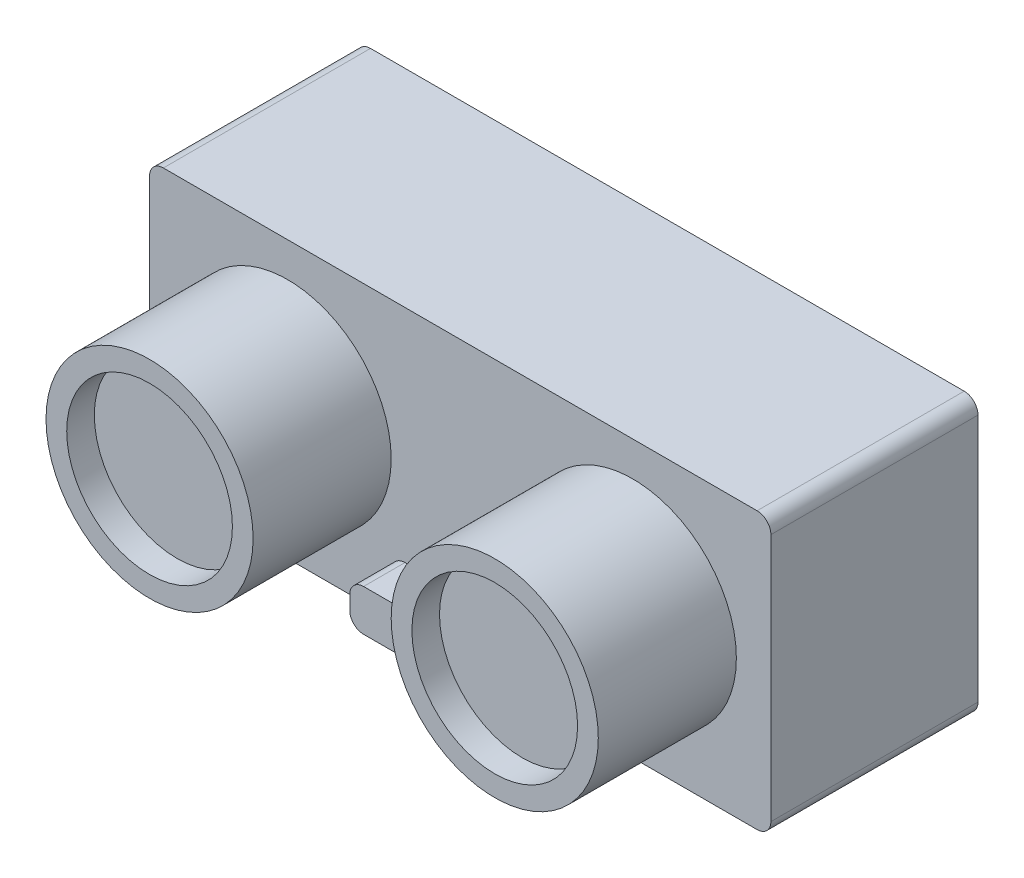
ISO-10303-21;
HEADER;
FILE_DESCRIPTION(('STEP AP214'),'2;1');
FILE_NAME('part.step','',(''),(''),'','','');
FILE_SCHEMA(('AUTOMOTIVE_DESIGN { 1 0 10303 214 1 1 1 1 }'));
ENDSEC;
DATA;
#1=APPLICATION_CONTEXT('core data for automotive mechanical design processes');
#2=APPLICATION_PROTOCOL_DEFINITION('international standard','automotive_design',2000,#1);
#3=PRODUCT_CONTEXT('',#1,'mechanical');
#4=PRODUCT('Part','Part','',(#3));
#5=PRODUCT_RELATED_PRODUCT_CATEGORY('part','',(#4));
#6=PRODUCT_DEFINITION_FORMATION('','',#4);
#7=PRODUCT_DEFINITION_CONTEXT('part definition',#1,'design');
#8=PRODUCT_DEFINITION('design','',#6,#7);
#9=PRODUCT_DEFINITION_SHAPE('','',#8);
#10=(LENGTH_UNIT() NAMED_UNIT(*) SI_UNIT(.MILLI.,.METRE.));
#11=(NAMED_UNIT(*) PLANE_ANGLE_UNIT() SI_UNIT($,.RADIAN.));
#12=(NAMED_UNIT(*) SI_UNIT($,.STERADIAN.) SOLID_ANGLE_UNIT());
#13=UNCERTAINTY_MEASURE_WITH_UNIT(LENGTH_MEASURE(1.E-05),#10,'distance_accuracy_value','');
#14=(GEOMETRIC_REPRESENTATION_CONTEXT(3) GLOBAL_UNCERTAINTY_ASSIGNED_CONTEXT((#13)) GLOBAL_UNIT_ASSIGNED_CONTEXT((#10,
#11,#12)) REPRESENTATION_CONTEXT('',''));
#15=CARTESIAN_POINT('',(0.,0.,0.));
#16=DIRECTION('',(0.,0.,1.));
#17=DIRECTION('',(1.,0.,0.));
#18=AXIS2_PLACEMENT_3D('',#15,#16,#17);
#19=CARTESIAN_POINT('',(44.,19.,15.));
#20=DIRECTION('',(0.,0.,-1.));
#21=DIRECTION('',(-1.,0.,0.));
#22=AXIS2_PLACEMENT_3D('',#19,#20,#21);
#23=PLANE('',#22);
#24=CARTESIAN_POINT('',(44.,19.,15.));
#25=DIRECTION('',(0.,0.,1.));
#26=DIRECTION('',(-1.,0.,0.));
#27=AXIS2_PLACEMENT_3D('',#24,#25,#26);
#28=CIRCLE('',#27,1.);
#29=CARTESIAN_POINT('',(45.,19.,15.));
#30=VERTEX_POINT('',#29);
#31=CARTESIAN_POINT('',(44.,20.,15.));
#32=VERTEX_POINT('',#31);
#33=EDGE_CURVE('E191',#30,#32,#28,.T.);
#34=ORIENTED_EDGE('',*,*,#33,.T.);
#35=DIRECTION('',(-1.,0.,0.));
#36=VECTOR('',#35,1.);
#37=CARTESIAN_POINT('',(1.00000000000001,20.,15.));
#38=LINE('',#37,#36);
#39=CARTESIAN_POINT('',(1.00000000000001,20.,15.));
#40=VERTEX_POINT('',#39);
#41=EDGE_CURVE('E194',#32,#40,#38,.T.);
#42=ORIENTED_EDGE('',*,*,#41,.T.);
#43=CARTESIAN_POINT('',(1.,19.,15.));
#44=DIRECTION('',(0.,0.,1.));
#45=DIRECTION('',(-1.,0.,0.));
#46=AXIS2_PLACEMENT_3D('',#43,#44,#45);
#47=CIRCLE('',#46,1.);
#48=CARTESIAN_POINT('',(0.,19.,15.));
#49=VERTEX_POINT('',#48);
#50=EDGE_CURVE('E197',#40,#49,#47,.T.);
#51=ORIENTED_EDGE('',*,*,#50,.T.);
#52=DIRECTION('',(0.,-1.,0.));
#53=VECTOR('',#52,1.);
#54=CARTESIAN_POINT('',(0.,1.00000000000001,15.));
#55=LINE('',#54,#53);
#56=CARTESIAN_POINT('',(0.,1.00000000000001,15.));
#57=VERTEX_POINT('',#56);
#58=EDGE_CURVE('E199',#49,#57,#55,.T.);
#59=ORIENTED_EDGE('',*,*,#58,.T.);
#60=CARTESIAN_POINT('',(1.,1.,15.));
#61=DIRECTION('',(0.,0.,1.));
#62=DIRECTION('',(-1.,0.,0.));
#63=AXIS2_PLACEMENT_3D('',#60,#61,#62);
#64=CIRCLE('',#63,1.);
#65=CARTESIAN_POINT('',(1.00000000000001,0.,15.));
#66=VERTEX_POINT('',#65);
#67=EDGE_CURVE('E201',#57,#66,#64,.T.);
#68=ORIENTED_EDGE('',*,*,#67,.T.);
#69=DIRECTION('',(1.,0.,0.));
#70=VECTOR('',#69,1.);
#71=CARTESIAN_POINT('',(1.00000000000001,0.,15.));
#72=LINE('',#71,#70);
#73=CARTESIAN_POINT('',(44.,0.,15.));
#74=VERTEX_POINT('',#73);
#75=EDGE_CURVE('E203',#66,#74,#72,.T.);
#76=ORIENTED_EDGE('',*,*,#75,.T.);
#77=CARTESIAN_POINT('',(44.,1.,15.));
#78=DIRECTION('',(0.,0.,1.));
#79=DIRECTION('',(1.,0.,0.));
#80=AXIS2_PLACEMENT_3D('',#77,#78,#79);
#81=CIRCLE('',#80,1.);
#82=CARTESIAN_POINT('',(45.,1.,15.));
#83=VERTEX_POINT('',#82);
#84=EDGE_CURVE('E205',#74,#83,#81,.T.);
#85=ORIENTED_EDGE('',*,*,#84,.T.);
#86=DIRECTION('',(0.,1.,0.));
#87=VECTOR('',#86,1.);
#88=CARTESIAN_POINT('',(45.,1.00000000000001,15.));
#89=LINE('',#88,#87);
#90=EDGE_CURVE('E207',#83,#30,#89,.T.);
#91=ORIENTED_EDGE('',*,*,#90,.T.);
#92=EDGE_LOOP('',(#34,#42,#51,#59,#68,#76,#85,#91));
#93=FACE_BOUND('',#92,.T.);
#94=CARTESIAN_POINT('',(9.99999999999999,10.,15.));
#95=DIRECTION('',(0.,0.,-1.));
#96=DIRECTION('',(-1.,0.,0.));
#97=AXIS2_PLACEMENT_3D('',#94,#95,#96);
#98=CIRCLE('',#97,7.5);
#99=CARTESIAN_POINT('',(2.5,10.,15.));
#100=VERTEX_POINT('',#99);
#101=EDGE_CURVE('E41',#100,#100,#98,.F.);
#102=ORIENTED_EDGE('',*,*,#101,.F.);
#103=EDGE_LOOP('',(#102));
#104=FACE_BOUND('',#103,.T.);
#105=CARTESIAN_POINT('',(35.,10.,15.));
#106=DIRECTION('',(0.,0.,-1.));
#107=DIRECTION('',(-1.,0.,0.));
#108=AXIS2_PLACEMENT_3D('',#105,#106,#107);
#109=CIRCLE('',#108,7.5);
#110=CARTESIAN_POINT('',(27.5,10.,15.));
#111=VERTEX_POINT('',#110);
#112=EDGE_CURVE('E11',#111,#111,#109,.F.);
#113=ORIENTED_EDGE('',*,*,#112,.F.);
#114=EDGE_LOOP('',(#113));
#115=FACE_BOUND('',#114,.T.);
#116=CARTESIAN_POINT('',(26.5,3.,15.));
#117=DIRECTION('',(0.,0.,1.));
#118=DIRECTION('',(-1.,0.,0.));
#119=AXIS2_PLACEMENT_3D('',#116,#117,#118);
#120=CIRCLE('',#119,1.);
#121=CARTESIAN_POINT('',(27.5,2.99999999999999,15.));
#122=VERTEX_POINT('',#121);
#123=CARTESIAN_POINT('',(26.5,4.,15.));
#124=VERTEX_POINT('',#123);
#125=EDGE_CURVE('E166',#122,#124,#120,.T.);
#126=ORIENTED_EDGE('',*,*,#125,.F.);
#127=DIRECTION('',(0.,1.,0.));
#128=VECTOR('',#127,1.);
#129=CARTESIAN_POINT('',(27.5,2.99999999999999,15.));
#130=LINE('',#129,#128);
#131=CARTESIAN_POINT('',(27.5,2.,15.));
#132=VERTEX_POINT('',#131);
#133=EDGE_CURVE('E163',#132,#122,#130,.T.);
#134=ORIENTED_EDGE('',*,*,#133,.F.);
#135=CARTESIAN_POINT('',(26.5,2.,15.));
#136=DIRECTION('',(0.,0.,1.));
#137=DIRECTION('',(1.,0.,0.));
#138=AXIS2_PLACEMENT_3D('',#135,#136,#137);
#139=CIRCLE('',#138,1.);
#140=CARTESIAN_POINT('',(26.5,1.,15.));
#141=VERTEX_POINT('',#140);
#142=EDGE_CURVE('E266',#141,#132,#139,.T.);
#143=ORIENTED_EDGE('',*,*,#142,.F.);
#144=DIRECTION('',(1.,0.,0.));
#145=VECTOR('',#144,1.);
#146=CARTESIAN_POINT('',(18.5,1.,15.));
#147=LINE('',#146,#145);
#148=CARTESIAN_POINT('',(18.5,1.,15.));
#149=VERTEX_POINT('',#148);
#150=EDGE_CURVE('E300',#149,#141,#147,.T.);
#151=ORIENTED_EDGE('',*,*,#150,.F.);
#152=CARTESIAN_POINT('',(18.5,2.,15.));
#153=DIRECTION('',(0.,0.,1.));
#154=DIRECTION('',(1.,0.,0.));
#155=AXIS2_PLACEMENT_3D('',#152,#153,#154);
#156=CIRCLE('',#155,1.);
#157=CARTESIAN_POINT('',(17.5,2.,15.));
#158=VERTEX_POINT('',#157);
#159=EDGE_CURVE('E294',#158,#149,#156,.T.);
#160=ORIENTED_EDGE('',*,*,#159,.F.);
#161=DIRECTION('',(0.,-1.,0.));
#162=VECTOR('',#161,1.);
#163=CARTESIAN_POINT('',(17.5,2.99999999999999,15.));
#164=LINE('',#163,#162);
#165=CARTESIAN_POINT('',(17.5,2.99999999999999,15.));
#166=VERTEX_POINT('',#165);
#167=EDGE_CURVE('E289',#166,#158,#164,.T.);
#168=ORIENTED_EDGE('',*,*,#167,.F.);
#169=CARTESIAN_POINT('',(18.5,3.,15.));
#170=DIRECTION('',(0.,0.,1.));
#171=DIRECTION('',(1.,0.,0.));
#172=AXIS2_PLACEMENT_3D('',#169,#170,#171);
#173=CIRCLE('',#172,1.);
#174=CARTESIAN_POINT('',(18.5,4.,15.));
#175=VERTEX_POINT('',#174);
#176=EDGE_CURVE('E53',#175,#166,#173,.T.);
#177=ORIENTED_EDGE('',*,*,#176,.F.);
#178=DIRECTION('',(-1.,0.,0.));
#179=VECTOR('',#178,1.);
#180=CARTESIAN_POINT('',(18.5,4.,15.));
#181=LINE('',#180,#179);
#182=EDGE_CURVE('E48',#124,#175,#181,.T.);
#183=ORIENTED_EDGE('',*,*,#182,.F.);
#184=EDGE_LOOP('',(#126,#134,#143,#151,#160,#168,#177,#183));
#185=FACE_BOUND('',#184,.T.);
#186=ADVANCED_FACE('F33',(#93,#104,#115,#185),#23,.F.);
#187=CARTESIAN_POINT('',(44.,19.,15.));
#188=DIRECTION('',(0.,0.,-1.));
#189=DIRECTION('',(-1.,0.,0.));
#190=AXIS2_PLACEMENT_3D('',#187,#188,#189);
#191=CYLINDRICAL_SURFACE('',#190,1.);
#192=CARTESIAN_POINT('',(44.,19.,0.));
#193=DIRECTION('',(0.,0.,1.));
#194=DIRECTION('',(-1.,0.,0.));
#195=AXIS2_PLACEMENT_3D('',#192,#193,#194);
#196=CIRCLE('',#195,1.);
#197=CARTESIAN_POINT('',(45.,19.,0.));
#198=VERTEX_POINT('',#197);
#199=CARTESIAN_POINT('',(44.,20.,0.));
#200=VERTEX_POINT('',#199);
#201=EDGE_CURVE('E190',#198,#200,#196,.T.);
#202=ORIENTED_EDGE('',*,*,#201,.T.);
#203=DIRECTION('',(0.,0.,-1.));
#204=VECTOR('',#203,1.);
#205=CARTESIAN_POINT('',(44.,20.,15.));
#206=LINE('',#205,#204);
#207=EDGE_CURVE('E245',#32,#200,#206,.T.);
#208=ORIENTED_EDGE('',*,*,#207,.F.);
#209=ORIENTED_EDGE('',*,*,#33,.F.);
#210=DIRECTION('',(0.,0.,-1.));
#211=VECTOR('',#210,1.);
#212=CARTESIAN_POINT('',(45.,19.,15.));
#213=LINE('',#212,#211);
#214=EDGE_CURVE('E209',#30,#198,#213,.T.);
#215=ORIENTED_EDGE('',*,*,#214,.T.);
#216=EDGE_LOOP('',(#202,#208,#209,#215));
#217=FACE_BOUND('',#216,.T.);
#218=ADVANCED_FACE('F35',(#217),#191,.T.);
#219=CARTESIAN_POINT('',(1.00000000000001,20.,15.));
#220=DIRECTION('',(0.,-1.,0.));
#221=DIRECTION('',(0.,0.,-1.));
#222=AXIS2_PLACEMENT_3D('',#219,#220,#221);
#223=PLANE('',#222);
#224=DIRECTION('',(-1.,0.,0.));
#225=VECTOR('',#224,1.);
#226=CARTESIAN_POINT('',(1.00000000000001,20.,0.));
#227=LINE('',#226,#225);
#228=CARTESIAN_POINT('',(1.00000000000001,20.,0.));
#229=VERTEX_POINT('',#228);
#230=EDGE_CURVE('E212',#200,#229,#227,.T.);
#231=ORIENTED_EDGE('',*,*,#230,.T.);
#232=DIRECTION('',(0.,0.,-1.));
#233=VECTOR('',#232,1.);
#234=CARTESIAN_POINT('',(1.00000000000001,20.,15.));
#235=LINE('',#234,#233);
#236=EDGE_CURVE('E242',#40,#229,#235,.T.);
#237=ORIENTED_EDGE('',*,*,#236,.F.);
#238=ORIENTED_EDGE('',*,*,#41,.F.);
#239=ORIENTED_EDGE('',*,*,#207,.T.);
#240=EDGE_LOOP('',(#231,#237,#238,#239));
#241=FACE_BOUND('',#240,.T.);
#242=ADVANCED_FACE('F393',(#241),#223,.F.);
#243=CARTESIAN_POINT('',(1.,19.,15.));
#244=DIRECTION('',(0.,0.,-1.));
#245=DIRECTION('',(-1.,0.,0.));
#246=AXIS2_PLACEMENT_3D('',#243,#244,#245);
#247=CYLINDRICAL_SURFACE('',#246,1.);
#248=CARTESIAN_POINT('',(1.,19.,0.));
#249=DIRECTION('',(0.,0.,1.));
#250=DIRECTION('',(-1.,0.,0.));
#251=AXIS2_PLACEMENT_3D('',#248,#249,#250);
#252=CIRCLE('',#251,1.);
#253=CARTESIAN_POINT('',(0.,19.,0.));
#254=VERTEX_POINT('',#253);
#255=EDGE_CURVE('E214',#229,#254,#252,.T.);
#256=ORIENTED_EDGE('',*,*,#255,.T.);
#257=DIRECTION('',(0.,0.,-1.));
#258=VECTOR('',#257,1.);
#259=CARTESIAN_POINT('',(0.,19.,15.));
#260=LINE('',#259,#258);
#261=EDGE_CURVE('E239',#49,#254,#260,.T.);
#262=ORIENTED_EDGE('',*,*,#261,.F.);
#263=ORIENTED_EDGE('',*,*,#50,.F.);
#264=ORIENTED_EDGE('',*,*,#236,.T.);
#265=EDGE_LOOP('',(#256,#262,#263,#264));
#266=FACE_BOUND('',#265,.T.);
#267=ADVANCED_FACE('F390',(#266),#247,.T.);
#268=CARTESIAN_POINT('',(0.,1.00000000000001,15.));
#269=DIRECTION('',(1.,0.,0.));
#270=DIRECTION('',(0.,0.,-1.));
#271=AXIS2_PLACEMENT_3D('',#268,#269,#270);
#272=PLANE('',#271);
#273=DIRECTION('',(0.,-1.,0.));
#274=VECTOR('',#273,1.);
#275=CARTESIAN_POINT('',(0.,1.00000000000001,0.));
#276=LINE('',#275,#274);
#277=CARTESIAN_POINT('',(0.,1.00000000000001,0.));
#278=VERTEX_POINT('',#277);
#279=EDGE_CURVE('E216',#254,#278,#276,.T.);
#280=ORIENTED_EDGE('',*,*,#279,.T.);
#281=DIRECTION('',(0.,0.,-1.));
#282=VECTOR('',#281,1.);
#283=CARTESIAN_POINT('',(0.,1.00000000000001,15.));
#284=LINE('',#283,#282);
#285=EDGE_CURVE('E236',#57,#278,#284,.T.);
#286=ORIENTED_EDGE('',*,*,#285,.F.);
#287=ORIENTED_EDGE('',*,*,#58,.F.);
#288=ORIENTED_EDGE('',*,*,#261,.T.);
#289=EDGE_LOOP('',(#280,#286,#287,#288));
#290=FACE_BOUND('',#289,.T.);
#291=ADVANCED_FACE('F386',(#290),#272,.F.);
#292=CARTESIAN_POINT('',(1.,1.,15.));
#293=DIRECTION('',(0.,0.,-1.));
#294=DIRECTION('',(-1.,0.,0.));
#295=AXIS2_PLACEMENT_3D('',#292,#293,#294);
#296=CYLINDRICAL_SURFACE('',#295,1.);
#297=CARTESIAN_POINT('',(1.,1.,0.));
#298=DIRECTION('',(0.,0.,1.));
#299=DIRECTION('',(-1.,0.,0.));
#300=AXIS2_PLACEMENT_3D('',#297,#298,#299);
#301=CIRCLE('',#300,1.);
#302=CARTESIAN_POINT('',(1.00000000000001,0.,0.));
#303=VERTEX_POINT('',#302);
#304=EDGE_CURVE('E218',#278,#303,#301,.T.);
#305=ORIENTED_EDGE('',*,*,#304,.T.);
#306=DIRECTION('',(0.,0.,-1.));
#307=VECTOR('',#306,1.);
#308=CARTESIAN_POINT('',(1.00000000000001,0.,15.));
#309=LINE('',#308,#307);
#310=EDGE_CURVE('E233',#66,#303,#309,.T.);
#311=ORIENTED_EDGE('',*,*,#310,.F.);
#312=ORIENTED_EDGE('',*,*,#67,.F.);
#313=ORIENTED_EDGE('',*,*,#285,.T.);
#314=EDGE_LOOP('',(#305,#311,#312,#313));
#315=FACE_BOUND('',#314,.T.);
#316=ADVANCED_FACE('F382',(#315),#296,.T.);
#317=CARTESIAN_POINT('',(1.00000000000001,0.,15.));
#318=DIRECTION('',(0.,1.,0.));
#319=DIRECTION('',(0.,0.,1.));
#320=AXIS2_PLACEMENT_3D('',#317,#318,#319);
#321=PLANE('',#320);
#322=DIRECTION('',(1.,0.,0.));
#323=VECTOR('',#322,1.);
#324=CARTESIAN_POINT('',(1.00000000000001,0.,0.));
#325=LINE('',#324,#323);
#326=CARTESIAN_POINT('',(44.,0.,0.));
#327=VERTEX_POINT('',#326);
#328=EDGE_CURVE('E220',#303,#327,#325,.T.);
#329=ORIENTED_EDGE('',*,*,#328,.T.);
#330=DIRECTION('',(0.,0.,-1.));
#331=VECTOR('',#330,1.);
#332=CARTESIAN_POINT('',(44.,0.,15.));
#333=LINE('',#332,#331);
#334=EDGE_CURVE('E230',#74,#327,#333,.T.);
#335=ORIENTED_EDGE('',*,*,#334,.F.);
#336=ORIENTED_EDGE('',*,*,#75,.F.);
#337=ORIENTED_EDGE('',*,*,#310,.T.);
#338=EDGE_LOOP('',(#329,#335,#336,#337));
#339=FACE_BOUND('',#338,.T.);
#340=ADVANCED_FACE('F378',(#339),#321,.F.);
#341=CARTESIAN_POINT('',(44.,1.,15.));
#342=DIRECTION('',(0.,0.,-1.));
#343=DIRECTION('',(-1.,0.,0.));
#344=AXIS2_PLACEMENT_3D('',#341,#342,#343);
#345=CYLINDRICAL_SURFACE('',#344,1.);
#346=CARTESIAN_POINT('',(44.,1.,0.));
#347=DIRECTION('',(0.,0.,1.));
#348=DIRECTION('',(1.,0.,0.));
#349=AXIS2_PLACEMENT_3D('',#346,#347,#348);
#350=CIRCLE('',#349,1.);
#351=CARTESIAN_POINT('',(45.,1.,0.));
#352=VERTEX_POINT('',#351);
#353=EDGE_CURVE('E222',#327,#352,#350,.T.);
#354=ORIENTED_EDGE('',*,*,#353,.T.);
#355=DIRECTION('',(0.,0.,-1.));
#356=VECTOR('',#355,1.);
#357=CARTESIAN_POINT('',(45.,1.,15.));
#358=LINE('',#357,#356);
#359=EDGE_CURVE('E227',#83,#352,#358,.T.);
#360=ORIENTED_EDGE('',*,*,#359,.F.);
#361=ORIENTED_EDGE('',*,*,#84,.F.);
#362=ORIENTED_EDGE('',*,*,#334,.T.);
#363=EDGE_LOOP('',(#354,#360,#361,#362));
#364=FACE_BOUND('',#363,.T.);
#365=ADVANCED_FACE('F374',(#364),#345,.T.);
#366=CARTESIAN_POINT('',(45.,1.00000000000001,15.));
#367=DIRECTION('',(-1.,0.,0.));
#368=DIRECTION('',(0.,0.,1.));
#369=AXIS2_PLACEMENT_3D('',#366,#367,#368);
#370=PLANE('',#369);
#371=DIRECTION('',(0.,1.,0.));
#372=VECTOR('',#371,1.);
#373=CARTESIAN_POINT('',(45.,1.00000000000001,0.));
#374=LINE('',#373,#372);
#375=EDGE_CURVE('E195',#352,#198,#374,.T.);
#376=ORIENTED_EDGE('',*,*,#375,.T.);
#377=ORIENTED_EDGE('',*,*,#214,.F.);
#378=ORIENTED_EDGE('',*,*,#90,.F.);
#379=ORIENTED_EDGE('',*,*,#359,.T.);
#380=EDGE_LOOP('',(#376,#377,#378,#379));
#381=FACE_BOUND('',#380,.T.);
#382=ADVANCED_FACE('F370',(#381),#370,.F.);
#383=CARTESIAN_POINT('',(44.,19.,0.));
#384=DIRECTION('',(0.,0.,-1.));
#385=DIRECTION('',(-1.,0.,0.));
#386=AXIS2_PLACEMENT_3D('',#383,#384,#385);
#387=PLANE('',#386);
#388=ORIENTED_EDGE('',*,*,#201,.F.);
#389=ORIENTED_EDGE('',*,*,#375,.F.);
#390=ORIENTED_EDGE('',*,*,#353,.F.);
#391=ORIENTED_EDGE('',*,*,#328,.F.);
#392=ORIENTED_EDGE('',*,*,#304,.F.);
#393=ORIENTED_EDGE('',*,*,#279,.F.);
#394=ORIENTED_EDGE('',*,*,#255,.F.);
#395=ORIENTED_EDGE('',*,*,#230,.F.);
#396=EDGE_LOOP('',(#388,#389,#390,#391,#392,#393,#394,#395));
#397=FACE_BOUND('',#396,.T.);
#398=ADVANCED_FACE('F365',(#397),#387,.T.);
#399=CARTESIAN_POINT('',(9.99999999999999,10.,25.));
#400=DIRECTION('',(0.,0.,-1.));
#401=DIRECTION('',(-1.,0.,0.));
#402=AXIS2_PLACEMENT_3D('',#399,#400,#401);
#403=CYLINDRICAL_SURFACE('',#402,7.5);
#404=CARTESIAN_POINT('',(9.99999999999999,10.,25.));
#405=DIRECTION('',(0.,0.,1.));
#406=DIRECTION('',(1.,0.,0.));
#407=AXIS2_PLACEMENT_3D('',#404,#405,#406);
#408=CIRCLE('',#407,7.5);
#409=CARTESIAN_POINT('',(17.5,10.,25.));
#410=VERTEX_POINT('',#409);
#411=EDGE_CURVE('E187',#410,#410,#408,.T.);
#412=ORIENTED_EDGE('',*,*,#411,.F.);
#413=EDGE_LOOP('',(#412));
#414=FACE_BOUND('',#413,.T.);
#415=ORIENTED_EDGE('',*,*,#101,.T.);
#416=EDGE_LOOP('',(#415));
#417=FACE_BOUND('',#416,.T.);
#418=ADVANCED_FACE('F250',(#414,#417),#403,.T.);
#419=CARTESIAN_POINT('',(9.99999999999999,10.,25.));
#420=DIRECTION('',(0.,0.,1.));
#421=DIRECTION('',(1.,0.,0.));
#422=AXIS2_PLACEMENT_3D('',#419,#420,#421);
#423=PLANE('',#422);
#424=CARTESIAN_POINT('',(9.99999999999999,10.,25.));
#425=DIRECTION('',(0.,0.,1.));
#426=DIRECTION('',(1.,0.,0.));
#427=AXIS2_PLACEMENT_3D('',#424,#425,#426);
#428=CIRCLE('',#427,6.);
#429=CARTESIAN_POINT('',(16.,10.,25.));
#430=VERTEX_POINT('',#429);
#431=EDGE_CURVE('E177',#430,#430,#428,.T.);
#432=ORIENTED_EDGE('',*,*,#431,.F.);
#433=EDGE_LOOP('',(#432));
#434=FACE_BOUND('',#433,.T.);
#435=ORIENTED_EDGE('',*,*,#411,.T.);
#436=EDGE_LOOP('',(#435));
#437=FACE_BOUND('',#436,.T.);
#438=ADVANCED_FACE('F359',(#434,#437),#423,.T.);
#439=CARTESIAN_POINT('',(35.,10.,25.));
#440=DIRECTION('',(0.,0.,-1.));
#441=DIRECTION('',(-1.,0.,0.));
#442=AXIS2_PLACEMENT_3D('',#439,#440,#441);
#443=CYLINDRICAL_SURFACE('',#442,7.5);
#444=CARTESIAN_POINT('',(35.,10.,25.));
#445=DIRECTION('',(0.,0.,1.));
#446=DIRECTION('',(1.,0.,0.));
#447=AXIS2_PLACEMENT_3D('',#444,#445,#446);
#448=CIRCLE('',#447,7.5);
#449=CARTESIAN_POINT('',(42.5,10.,25.));
#450=VERTEX_POINT('',#449);
#451=EDGE_CURVE('E182',#450,#450,#448,.T.);
#452=ORIENTED_EDGE('',*,*,#451,.F.);
#453=EDGE_LOOP('',(#452));
#454=FACE_BOUND('',#453,.T.);
#455=ORIENTED_EDGE('',*,*,#112,.T.);
#456=EDGE_LOOP('',(#455));
#457=FACE_BOUND('',#456,.T.);
#458=ADVANCED_FACE('F355',(#454,#457),#443,.T.);
#459=CARTESIAN_POINT('',(35.,10.,25.));
#460=DIRECTION('',(0.,0.,1.));
#461=DIRECTION('',(1.,0.,0.));
#462=AXIS2_PLACEMENT_3D('',#459,#460,#461);
#463=PLANE('',#462);
#464=CARTESIAN_POINT('',(35.,10.,25.));
#465=DIRECTION('',(0.,0.,1.));
#466=DIRECTION('',(1.,0.,0.));
#467=AXIS2_PLACEMENT_3D('',#464,#465,#466);
#468=CIRCLE('',#467,5.99999999999999);
#469=CARTESIAN_POINT('',(41.,10.,25.));
#470=VERTEX_POINT('',#469);
#471=EDGE_CURVE('E167',#470,#470,#468,.T.);
#472=ORIENTED_EDGE('',*,*,#471,.F.);
#473=EDGE_LOOP('',(#472));
#474=FACE_BOUND('',#473,.T.);
#475=ORIENTED_EDGE('',*,*,#451,.T.);
#476=EDGE_LOOP('',(#475));
#477=FACE_BOUND('',#476,.T.);
#478=ADVANCED_FACE('F351',(#474,#477),#463,.T.);
#479=CARTESIAN_POINT('',(9.99999999999999,10.,23.));
#480=DIRECTION('',(0.,0.,1.));
#481=DIRECTION('',(1.,0.,0.));
#482=AXIS2_PLACEMENT_3D('',#479,#480,#481);
#483=CYLINDRICAL_SURFACE('',#482,6.);
#484=CARTESIAN_POINT('',(9.99999999999999,10.,23.));
#485=DIRECTION('',(0.,0.,1.));
#486=DIRECTION('',(1.,0.,0.));
#487=AXIS2_PLACEMENT_3D('',#484,#485,#486);
#488=CIRCLE('',#487,6.);
#489=CARTESIAN_POINT('',(16.,10.,23.));
#490=VERTEX_POINT('',#489);
#491=EDGE_CURVE('E179',#490,#490,#488,.T.);
#492=ORIENTED_EDGE('',*,*,#491,.F.);
#493=EDGE_LOOP('',(#492));
#494=FACE_BOUND('',#493,.T.);
#495=ORIENTED_EDGE('',*,*,#431,.T.);
#496=EDGE_LOOP('',(#495));
#497=FACE_BOUND('',#496,.T.);
#498=ADVANCED_FACE('F347',(#494,#497),#483,.F.);
#499=CARTESIAN_POINT('',(9.99999999999999,10.,23.));
#500=DIRECTION('',(0.,0.,1.));
#501=DIRECTION('',(1.,0.,0.));
#502=AXIS2_PLACEMENT_3D('',#499,#500,#501);
#503=PLANE('',#502);
#504=ORIENTED_EDGE('',*,*,#491,.T.);
#505=EDGE_LOOP('',(#504));
#506=FACE_BOUND('',#505,.T.);
#507=ADVANCED_FACE('F343',(#506),#503,.T.);
#508=CARTESIAN_POINT('',(35.,10.,23.));
#509=DIRECTION('',(0.,0.,1.));
#510=DIRECTION('',(1.,0.,0.));
#511=AXIS2_PLACEMENT_3D('',#508,#509,#510);
#512=CYLINDRICAL_SURFACE('',#511,5.99999999999999);
#513=CARTESIAN_POINT('',(35.,10.,23.));
#514=DIRECTION('',(0.,0.,1.));
#515=DIRECTION('',(1.,0.,0.));
#516=AXIS2_PLACEMENT_3D('',#513,#514,#515);
#517=CIRCLE('',#516,5.99999999999999);
#518=CARTESIAN_POINT('',(41.,10.,23.));
#519=VERTEX_POINT('',#518);
#520=EDGE_CURVE('E170',#519,#519,#517,.T.);
#521=ORIENTED_EDGE('',*,*,#520,.F.);
#522=EDGE_LOOP('',(#521));
#523=FACE_BOUND('',#522,.T.);
#524=ORIENTED_EDGE('',*,*,#471,.T.);
#525=EDGE_LOOP('',(#524));
#526=FACE_BOUND('',#525,.T.);
#527=ADVANCED_FACE('F339',(#523,#526),#512,.F.);
#528=CARTESIAN_POINT('',(35.,10.,23.));
#529=DIRECTION('',(0.,0.,1.));
#530=DIRECTION('',(1.,0.,0.));
#531=AXIS2_PLACEMENT_3D('',#528,#529,#530);
#532=PLANE('',#531);
#533=ORIENTED_EDGE('',*,*,#520,.T.);
#534=EDGE_LOOP('',(#533));
#535=FACE_BOUND('',#534,.T.);
#536=ADVANCED_FACE('F336',(#535),#532,.T.);
#537=CARTESIAN_POINT('',(26.5,3.,18.));
#538=DIRECTION('',(0.,0.,-1.));
#539=DIRECTION('',(-1.,0.,0.));
#540=AXIS2_PLACEMENT_3D('',#537,#538,#539);
#541=CYLINDRICAL_SURFACE('',#540,1.);
#542=ORIENTED_EDGE('',*,*,#125,.T.);
#543=DIRECTION('',(0.,0.,-1.));
#544=VECTOR('',#543,1.);
#545=CARTESIAN_POINT('',(26.5,4.,18.));
#546=LINE('',#545,#544);
#547=CARTESIAN_POINT('',(26.5,4.,18.));
#548=VERTEX_POINT('',#547);
#549=EDGE_CURVE('E147',#548,#124,#546,.T.);
#550=ORIENTED_EDGE('',*,*,#549,.F.);
#551=CARTESIAN_POINT('',(26.5,3.,18.));
#552=DIRECTION('',(0.,0.,1.));
#553=DIRECTION('',(-1.,0.,0.));
#554=AXIS2_PLACEMENT_3D('',#551,#552,#553);
#555=CIRCLE('',#554,1.);
#556=CARTESIAN_POINT('',(27.5,2.99999999999999,18.));
#557=VERTEX_POINT('',#556);
#558=EDGE_CURVE('E154',#557,#548,#555,.T.);
#559=ORIENTED_EDGE('',*,*,#558,.F.);
#560=DIRECTION('',(0.,0.,-1.));
#561=VECTOR('',#560,1.);
#562=CARTESIAN_POINT('',(27.5,2.99999999999999,18.));
#563=LINE('',#562,#561);
#564=EDGE_CURVE('E263',#557,#122,#563,.T.);
#565=ORIENTED_EDGE('',*,*,#564,.T.);
#566=EDGE_LOOP('',(#542,#550,#559,#565));
#567=FACE_BOUND('',#566,.T.);
#568=ADVANCED_FACE('F165',(#567),#541,.T.);
#569=CARTESIAN_POINT('',(18.5,4.,18.));
#570=DIRECTION('',(0.,-1.,0.));
#571=DIRECTION('',(1.,0.,0.));
#572=AXIS2_PLACEMENT_3D('',#569,#570,#571);
#573=PLANE('',#572);
#574=ORIENTED_EDGE('',*,*,#182,.T.);
#575=DIRECTION('',(0.,0.,-1.));
#576=VECTOR('',#575,1.);
#577=CARTESIAN_POINT('',(18.5,4.,18.));
#578=LINE('',#577,#576);
#579=CARTESIAN_POINT('',(18.5,4.,18.));
#580=VERTEX_POINT('',#579);
#581=EDGE_CURVE('E150',#580,#175,#578,.T.);
#582=ORIENTED_EDGE('',*,*,#581,.F.);
#583=DIRECTION('',(-1.,0.,0.));
#584=VECTOR('',#583,1.);
#585=CARTESIAN_POINT('',(18.5,4.,18.));
#586=LINE('',#585,#584);
#587=EDGE_CURVE('E143',#548,#580,#586,.T.);
#588=ORIENTED_EDGE('',*,*,#587,.F.);
#589=ORIENTED_EDGE('',*,*,#549,.T.);
#590=EDGE_LOOP('',(#574,#582,#588,#589));
#591=FACE_BOUND('',#590,.T.);
#592=ADVANCED_FACE('F145',(#591),#573,.F.);
#593=CARTESIAN_POINT('',(18.5,3.,18.));
#594=DIRECTION('',(0.,0.,-1.));
#595=DIRECTION('',(-1.,0.,0.));
#596=AXIS2_PLACEMENT_3D('',#593,#594,#595);
#597=CYLINDRICAL_SURFACE('',#596,1.);
#598=ORIENTED_EDGE('',*,*,#176,.T.);
#599=DIRECTION('',(0.,0.,-1.));
#600=VECTOR('',#599,1.);
#601=CARTESIAN_POINT('',(17.5,2.99999999999999,18.));
#602=LINE('',#601,#600);
#603=CARTESIAN_POINT('',(17.5,2.99999999999999,18.));
#604=VERTEX_POINT('',#603);
#605=EDGE_CURVE('E172',#604,#166,#602,.T.);
#606=ORIENTED_EDGE('',*,*,#605,.F.);
#607=CARTESIAN_POINT('',(18.5,3.,18.));
#608=DIRECTION('',(0.,0.,1.));
#609=DIRECTION('',(1.,0.,0.));
#610=AXIS2_PLACEMENT_3D('',#607,#608,#609);
#611=CIRCLE('',#610,1.);
#612=EDGE_CURVE('E153',#580,#604,#611,.T.);
#613=ORIENTED_EDGE('',*,*,#612,.F.);
#614=ORIENTED_EDGE('',*,*,#581,.T.);
#615=EDGE_LOOP('',(#598,#606,#613,#614));
#616=FACE_BOUND('',#615,.T.);
#617=ADVANCED_FACE('F292',(#616),#597,.T.);
#618=CARTESIAN_POINT('',(17.5,2.99999999999999,18.));
#619=DIRECTION('',(1.,0.,0.));
#620=DIRECTION('',(0.,0.,-1.));
#621=AXIS2_PLACEMENT_3D('',#618,#619,#620);
#622=PLANE('',#621);
#623=ORIENTED_EDGE('',*,*,#167,.T.);
#624=DIRECTION('',(0.,0.,-1.));
#625=VECTOR('',#624,1.);
#626=CARTESIAN_POINT('',(17.5,2.00000000000001,18.));
#627=LINE('',#626,#625);
#628=CARTESIAN_POINT('',(17.5,2.00000000000001,18.));
#629=VERTEX_POINT('',#628);
#630=EDGE_CURVE('E280',#629,#158,#627,.T.);
#631=ORIENTED_EDGE('',*,*,#630,.F.);
#632=DIRECTION('',(0.,-1.,0.));
#633=VECTOR('',#632,1.);
#634=CARTESIAN_POINT('',(17.5,2.99999999999999,18.));
#635=LINE('',#634,#633);
#636=EDGE_CURVE('E290',#604,#629,#635,.T.);
#637=ORIENTED_EDGE('',*,*,#636,.F.);
#638=ORIENTED_EDGE('',*,*,#605,.T.);
#639=EDGE_LOOP('',(#623,#631,#637,#638));
#640=FACE_BOUND('',#639,.T.);
#641=ADVANCED_FACE('F287',(#640),#622,.F.);
#642=CARTESIAN_POINT('',(18.5,2.,18.));
#643=DIRECTION('',(0.,0.,-1.));
#644=DIRECTION('',(-1.,0.,0.));
#645=AXIS2_PLACEMENT_3D('',#642,#643,#644);
#646=CYLINDRICAL_SURFACE('',#645,1.);
#647=ORIENTED_EDGE('',*,*,#159,.T.);
#648=DIRECTION('',(0.,0.,-1.));
#649=VECTOR('',#648,1.);
#650=CARTESIAN_POINT('',(18.5,1.,18.));
#651=LINE('',#650,#649);
#652=CARTESIAN_POINT('',(18.5,1.,18.));
#653=VERTEX_POINT('',#652);
#654=EDGE_CURVE('E277',#653,#149,#651,.T.);
#655=ORIENTED_EDGE('',*,*,#654,.F.);
#656=CARTESIAN_POINT('',(18.5,2.,18.));
#657=DIRECTION('',(0.,0.,1.));
#658=DIRECTION('',(1.,0.,0.));
#659=AXIS2_PLACEMENT_3D('',#656,#657,#658);
#660=CIRCLE('',#659,1.);
#661=EDGE_CURVE('E314',#629,#653,#660,.T.);
#662=ORIENTED_EDGE('',*,*,#661,.F.);
#663=ORIENTED_EDGE('',*,*,#630,.T.);
#664=EDGE_LOOP('',(#647,#655,#662,#663));
#665=FACE_BOUND('',#664,.T.);
#666=ADVANCED_FACE('F313',(#665),#646,.T.);
#667=CARTESIAN_POINT('',(18.5,1.,18.));
#668=DIRECTION('',(0.,1.,0.));
#669=DIRECTION('',(0.,0.,1.));
#670=AXIS2_PLACEMENT_3D('',#667,#668,#669);
#671=PLANE('',#670);
#672=ORIENTED_EDGE('',*,*,#150,.T.);
#673=DIRECTION('',(0.,0.,-1.));
#674=VECTOR('',#673,1.);
#675=CARTESIAN_POINT('',(26.5,1.,18.));
#676=LINE('',#675,#674);
#677=CARTESIAN_POINT('',(26.5,1.,18.));
#678=VERTEX_POINT('',#677);
#679=EDGE_CURVE('E269',#678,#141,#676,.T.);
#680=ORIENTED_EDGE('',*,*,#679,.F.);
#681=DIRECTION('',(1.,0.,0.));
#682=VECTOR('',#681,1.);
#683=CARTESIAN_POINT('',(18.5,1.,18.));
#684=LINE('',#683,#682);
#685=EDGE_CURVE('E310',#653,#678,#684,.T.);
#686=ORIENTED_EDGE('',*,*,#685,.F.);
#687=ORIENTED_EDGE('',*,*,#654,.T.);
#688=EDGE_LOOP('',(#672,#680,#686,#687));
#689=FACE_BOUND('',#688,.T.);
#690=ADVANCED_FACE('F307',(#689),#671,.F.);
#691=CARTESIAN_POINT('',(26.5,2.,18.));
#692=DIRECTION('',(0.,0.,-1.));
#693=DIRECTION('',(-1.,0.,0.));
#694=AXIS2_PLACEMENT_3D('',#691,#692,#693);
#695=CYLINDRICAL_SURFACE('',#694,1.);
#696=ORIENTED_EDGE('',*,*,#142,.T.);
#697=DIRECTION('',(0.,0.,-1.));
#698=VECTOR('',#697,1.);
#699=CARTESIAN_POINT('',(27.5,2.,18.));
#700=LINE('',#699,#698);
#701=CARTESIAN_POINT('',(27.5,2.,18.));
#702=VERTEX_POINT('',#701);
#703=EDGE_CURVE('E265',#702,#132,#700,.T.);
#704=ORIENTED_EDGE('',*,*,#703,.F.);
#705=CARTESIAN_POINT('',(26.5,2.,18.));
#706=DIRECTION('',(0.,0.,1.));
#707=DIRECTION('',(1.,0.,0.));
#708=AXIS2_PLACEMENT_3D('',#705,#706,#707);
#709=CIRCLE('',#708,1.);
#710=EDGE_CURVE('E271',#678,#702,#709,.T.);
#711=ORIENTED_EDGE('',*,*,#710,.F.);
#712=ORIENTED_EDGE('',*,*,#679,.T.);
#713=EDGE_LOOP('',(#696,#704,#711,#712));
#714=FACE_BOUND('',#713,.T.);
#715=ADVANCED_FACE('F303',(#714),#695,.T.);
#716=CARTESIAN_POINT('',(27.5,2.99999999999999,18.));
#717=DIRECTION('',(-1.,0.,0.));
#718=DIRECTION('',(0.,0.,1.));
#719=AXIS2_PLACEMENT_3D('',#716,#717,#718);
#720=PLANE('',#719);
#721=ORIENTED_EDGE('',*,*,#133,.T.);
#722=ORIENTED_EDGE('',*,*,#564,.F.);
#723=DIRECTION('',(0.,1.,0.));
#724=VECTOR('',#723,1.);
#725=CARTESIAN_POINT('',(27.5,2.99999999999999,18.));
#726=LINE('',#725,#724);
#727=EDGE_CURVE('E159',#702,#557,#726,.T.);
#728=ORIENTED_EDGE('',*,*,#727,.F.);
#729=ORIENTED_EDGE('',*,*,#703,.T.);
#730=EDGE_LOOP('',(#721,#722,#728,#729));
#731=FACE_BOUND('',#730,.T.);
#732=ADVANCED_FACE('F262',(#731),#720,.F.);
#733=CARTESIAN_POINT('',(26.5,3.,18.));
#734=DIRECTION('',(0.,0.,-1.));
#735=DIRECTION('',(-1.,0.,0.));
#736=AXIS2_PLACEMENT_3D('',#733,#734,#735);
#737=PLANE('',#736);
#738=ORIENTED_EDGE('',*,*,#558,.T.);
#739=ORIENTED_EDGE('',*,*,#587,.T.);
#740=ORIENTED_EDGE('',*,*,#612,.T.);
#741=ORIENTED_EDGE('',*,*,#636,.T.);
#742=ORIENTED_EDGE('',*,*,#661,.T.);
#743=ORIENTED_EDGE('',*,*,#685,.T.);
#744=ORIENTED_EDGE('',*,*,#710,.T.);
#745=ORIENTED_EDGE('',*,*,#727,.T.);
#746=EDGE_LOOP('',(#738,#739,#740,#741,#742,#743,#744,#745));
#747=FACE_BOUND('',#746,.T.);
#748=ADVANCED_FACE('F157',(#747),#737,.F.);
#749=CLOSED_SHELL('',(#186,#218,#242,#267,#291,#316,#340,#365,#382,#398,#418,#438,#458,#478,
#498,#507,#527,#536,#568,#592,#617,#641,#666,#690,#715,#732,#748));
#750=MANIFOLD_SOLID_BREP('B2',#749);
#751=ADVANCED_BREP_SHAPE_REPRESENTATION('',(#18,#750),#14);
#752=SHAPE_DEFINITION_REPRESENTATION(#9,#751);
ENDSEC;
END-ISO-10303-21;
